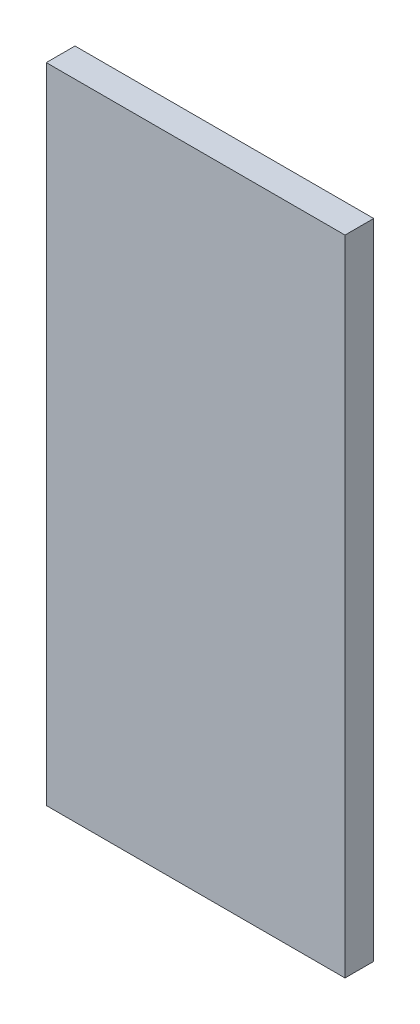
ISO-10303-21;
HEADER;
FILE_DESCRIPTION(('STEP AP214'),'2;1');
FILE_NAME('part.step','',(''),(''),'','','');
FILE_SCHEMA(('AUTOMOTIVE_DESIGN { 1 0 10303 214 1 1 1 1 }'));
ENDSEC;
DATA;
#1=APPLICATION_CONTEXT('core data for automotive mechanical design processes');
#2=APPLICATION_PROTOCOL_DEFINITION('international standard','automotive_design',2000,#1);
#3=PRODUCT_CONTEXT('',#1,'mechanical');
#4=PRODUCT('Part','Part','',(#3));
#5=PRODUCT_RELATED_PRODUCT_CATEGORY('part','',(#4));
#6=PRODUCT_DEFINITION_FORMATION('','',#4);
#7=PRODUCT_DEFINITION_CONTEXT('part definition',#1,'design');
#8=PRODUCT_DEFINITION('design','',#6,#7);
#9=PRODUCT_DEFINITION_SHAPE('','',#8);
#10=(LENGTH_UNIT() NAMED_UNIT(*) SI_UNIT(.MILLI.,.METRE.));
#11=(NAMED_UNIT(*) PLANE_ANGLE_UNIT() SI_UNIT($,.RADIAN.));
#12=(NAMED_UNIT(*) SI_UNIT($,.STERADIAN.) SOLID_ANGLE_UNIT());
#13=UNCERTAINTY_MEASURE_WITH_UNIT(LENGTH_MEASURE(1.E-05),#10,'distance_accuracy_value','');
#14=(GEOMETRIC_REPRESENTATION_CONTEXT(3) GLOBAL_UNCERTAINTY_ASSIGNED_CONTEXT((#13)) GLOBAL_UNIT_ASSIGNED_CONTEXT((#10,
#11,#12)) REPRESENTATION_CONTEXT('',''));
#15=CARTESIAN_POINT('',(0.,0.,0.));
#16=DIRECTION('',(0.,0.,1.));
#17=DIRECTION('',(1.,0.,0.));
#18=AXIS2_PLACEMENT_3D('',#15,#16,#17);
#19=CARTESIAN_POINT('',(-33.02,71.12,6.35));
#20=DIRECTION('',(1.,0.,0.));
#21=DIRECTION('',(0.,1.,0.));
#22=AXIS2_PLACEMENT_3D('',#19,#20,#21);
#23=PLANE('',#22);
#24=DIRECTION('',(0.,-1.,0.));
#25=VECTOR('',#24,1.);
#26=CARTESIAN_POINT('',(-33.02,71.12,0.));
#27=LINE('',#26,#25);
#28=CARTESIAN_POINT('',(-33.02,71.12,0.));
#29=VERTEX_POINT('',#28);
#30=CARTESIAN_POINT('',(-33.02,-71.12,0.));
#31=VERTEX_POINT('',#30);
#32=EDGE_CURVE('E115',#29,#31,#27,.T.);
#33=ORIENTED_EDGE('',*,*,#32,.T.);
#34=DIRECTION('',(0.,0.,-1.));
#35=VECTOR('',#34,1.);
#36=CARTESIAN_POINT('',(-33.02,-71.12,6.35));
#37=LINE('',#36,#35);
#38=CARTESIAN_POINT('',(-33.02,-71.12,6.35));
#39=VERTEX_POINT('',#38);
#40=EDGE_CURVE('E11',#39,#31,#37,.T.);
#41=ORIENTED_EDGE('',*,*,#40,.F.);
#42=DIRECTION('',(0.,-1.,0.));
#43=VECTOR('',#42,1.);
#44=CARTESIAN_POINT('',(-33.02,71.12,6.35));
#45=LINE('',#44,#43);
#46=CARTESIAN_POINT('',(-33.02,71.12,6.35));
#47=VERTEX_POINT('',#46);
#48=EDGE_CURVE('E99',#47,#39,#45,.T.);
#49=ORIENTED_EDGE('',*,*,#48,.F.);
#50=DIRECTION('',(0.,0.,-1.));
#51=VECTOR('',#50,1.);
#52=CARTESIAN_POINT('',(-33.02,71.12,6.35));
#53=LINE('',#52,#51);
#54=EDGE_CURVE('E111',#47,#29,#53,.T.);
#55=ORIENTED_EDGE('',*,*,#54,.T.);
#56=EDGE_LOOP('',(#33,#41,#49,#55));
#57=FACE_BOUND('',#56,.T.);
#58=ADVANCED_FACE('F47',(#57),#23,.F.);
#59=CARTESIAN_POINT('',(-33.02,-71.12,6.35));
#60=DIRECTION('',(0.,1.,0.));
#61=DIRECTION('',(0.,0.,1.));
#62=AXIS2_PLACEMENT_3D('',#59,#60,#61);
#63=PLANE('',#62);
#64=DIRECTION('',(1.,0.,0.));
#65=VECTOR('',#64,1.);
#66=CARTESIAN_POINT('',(-33.02,-71.12,0.));
#67=LINE('',#66,#65);
#68=CARTESIAN_POINT('',(33.02,-71.12,0.));
#69=VERTEX_POINT('',#68);
#70=EDGE_CURVE('E104',#31,#69,#67,.T.);
#71=ORIENTED_EDGE('',*,*,#70,.T.);
#72=DIRECTION('',(0.,0.,-1.));
#73=VECTOR('',#72,1.);
#74=CARTESIAN_POINT('',(33.02,-71.12,6.35));
#75=LINE('',#74,#73);
#76=CARTESIAN_POINT('',(33.02,-71.12,6.35));
#77=VERTEX_POINT('',#76);
#78=EDGE_CURVE('E56',#77,#69,#75,.T.);
#79=ORIENTED_EDGE('',*,*,#78,.F.);
#80=DIRECTION('',(1.,0.,0.));
#81=VECTOR('',#80,1.);
#82=CARTESIAN_POINT('',(-33.02,-71.12,6.35));
#83=LINE('',#82,#81);
#84=EDGE_CURVE('E94',#39,#77,#83,.T.);
#85=ORIENTED_EDGE('',*,*,#84,.F.);
#86=ORIENTED_EDGE('',*,*,#40,.T.);
#87=EDGE_LOOP('',(#71,#79,#85,#86));
#88=FACE_BOUND('',#87,.T.);
#89=ADVANCED_FACE('F103',(#88),#63,.F.);
#90=CARTESIAN_POINT('',(33.02,71.12,6.35));
#91=DIRECTION('',(-1.,0.,0.));
#92=DIRECTION('',(0.,0.,1.));
#93=AXIS2_PLACEMENT_3D('',#90,#91,#92);
#94=PLANE('',#93);
#95=DIRECTION('',(0.,1.,0.));
#96=VECTOR('',#95,1.);
#97=CARTESIAN_POINT('',(33.02,71.12,0.));
#98=LINE('',#97,#96);
#99=CARTESIAN_POINT('',(33.02,71.12,0.));
#100=VERTEX_POINT('',#99);
#101=EDGE_CURVE('E81',#69,#100,#98,.T.);
#102=ORIENTED_EDGE('',*,*,#101,.T.);
#103=DIRECTION('',(0.,0.,-1.));
#104=VECTOR('',#103,1.);
#105=CARTESIAN_POINT('',(33.02,71.12,6.35));
#106=LINE('',#105,#104);
#107=CARTESIAN_POINT('',(33.02,71.12,6.35));
#108=VERTEX_POINT('',#107);
#109=EDGE_CURVE('E106',#108,#100,#106,.T.);
#110=ORIENTED_EDGE('',*,*,#109,.F.);
#111=DIRECTION('',(0.,1.,0.));
#112=VECTOR('',#111,1.);
#113=CARTESIAN_POINT('',(33.02,71.12,6.35));
#114=LINE('',#113,#112);
#115=EDGE_CURVE('E97',#77,#108,#114,.T.);
#116=ORIENTED_EDGE('',*,*,#115,.F.);
#117=ORIENTED_EDGE('',*,*,#78,.T.);
#118=EDGE_LOOP('',(#102,#110,#116,#117));
#119=FACE_BOUND('',#118,.T.);
#120=ADVANCED_FACE('F107',(#119),#94,.F.);
#121=CARTESIAN_POINT('',(-33.02,71.12,6.35));
#122=DIRECTION('',(0.,-1.,0.));
#123=DIRECTION('',(0.,0.,-1.));
#124=AXIS2_PLACEMENT_3D('',#121,#122,#123);
#125=PLANE('',#124);
#126=DIRECTION('',(-1.,0.,0.));
#127=VECTOR('',#126,1.);
#128=CARTESIAN_POINT('',(-33.02,71.12,0.));
#129=LINE('',#128,#127);
#130=EDGE_CURVE('E87',#100,#29,#129,.T.);
#131=ORIENTED_EDGE('',*,*,#130,.T.);
#132=ORIENTED_EDGE('',*,*,#54,.F.);
#133=DIRECTION('',(-1.,0.,0.));
#134=VECTOR('',#133,1.);
#135=CARTESIAN_POINT('',(-33.02,71.12,6.35));
#136=LINE('',#135,#134);
#137=EDGE_CURVE('E64',#108,#47,#136,.T.);
#138=ORIENTED_EDGE('',*,*,#137,.F.);
#139=ORIENTED_EDGE('',*,*,#109,.T.);
#140=EDGE_LOOP('',(#131,#132,#138,#139));
#141=FACE_BOUND('',#140,.T.);
#142=ADVANCED_FACE('F128',(#141),#125,.F.);
#143=CARTESIAN_POINT('',(0.,0.,6.35));
#144=DIRECTION('',(0.,0.,1.));
#145=DIRECTION('',(1.,0.,0.));
#146=AXIS2_PLACEMENT_3D('',#143,#144,#145);
#147=PLANE('',#146);
#148=ORIENTED_EDGE('',*,*,#48,.T.);
#149=ORIENTED_EDGE('',*,*,#84,.T.);
#150=ORIENTED_EDGE('',*,*,#115,.T.);
#151=ORIENTED_EDGE('',*,*,#137,.T.);
#152=EDGE_LOOP('',(#148,#149,#150,#151));
#153=FACE_BOUND('',#152,.T.);
#154=ADVANCED_FACE('F95',(#153),#147,.T.);
#155=CARTESIAN_POINT('',(0.,0.,0.));
#156=DIRECTION('',(0.,0.,1.));
#157=DIRECTION('',(1.,0.,0.));
#158=AXIS2_PLACEMENT_3D('',#155,#156,#157);
#159=PLANE('',#158);
#160=ORIENTED_EDGE('',*,*,#32,.F.);
#161=ORIENTED_EDGE('',*,*,#130,.F.);
#162=ORIENTED_EDGE('',*,*,#101,.F.);
#163=ORIENTED_EDGE('',*,*,#70,.F.);
#164=EDGE_LOOP('',(#160,#161,#162,#163));
#165=FACE_BOUND('',#164,.T.);
#166=ADVANCED_FACE('F131',(#165),#159,.F.);
#167=CLOSED_SHELL('',(#58,#89,#120,#142,#154,#166));
#168=MANIFOLD_SOLID_BREP('B2',#167);
#169=ADVANCED_BREP_SHAPE_REPRESENTATION('',(#18,#168),#14);
#170=SHAPE_DEFINITION_REPRESENTATION(#9,#169);
ENDSEC;
END-ISO-10303-21;
